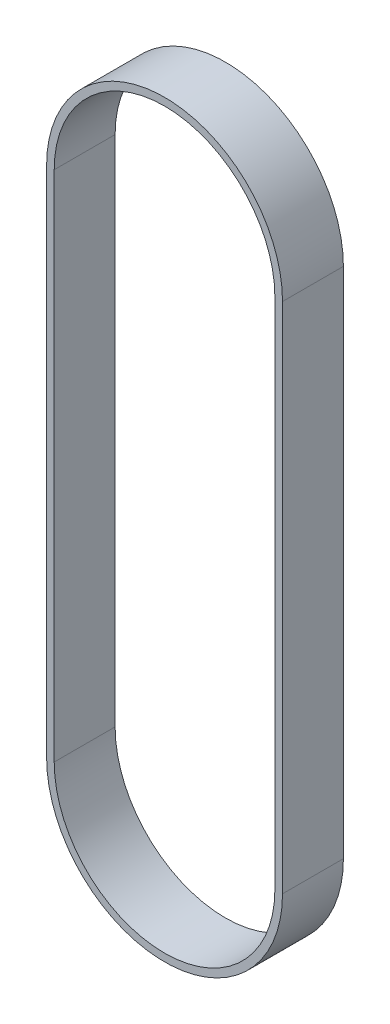
ISO-10303-21;
HEADER;
FILE_DESCRIPTION(('STEP AP214'),'2;1');
FILE_NAME('part.step','',(''),(''),'','','');
FILE_SCHEMA(('AUTOMOTIVE_DESIGN { 1 0 10303 214 1 1 1 1 }'));
ENDSEC;
DATA;
#1=APPLICATION_CONTEXT('core data for automotive mechanical design processes');
#2=APPLICATION_PROTOCOL_DEFINITION('international standard','automotive_design',2000,#1);
#3=PRODUCT_CONTEXT('',#1,'mechanical');
#4=PRODUCT('Part','Part','',(#3));
#5=PRODUCT_RELATED_PRODUCT_CATEGORY('part','',(#4));
#6=PRODUCT_DEFINITION_FORMATION('','',#4);
#7=PRODUCT_DEFINITION_CONTEXT('part definition',#1,'design');
#8=PRODUCT_DEFINITION('design','',#6,#7);
#9=PRODUCT_DEFINITION_SHAPE('','',#8);
#10=(LENGTH_UNIT() NAMED_UNIT(*) SI_UNIT(.MILLI.,.METRE.));
#11=(NAMED_UNIT(*) PLANE_ANGLE_UNIT() SI_UNIT($,.RADIAN.));
#12=(NAMED_UNIT(*) SI_UNIT($,.STERADIAN.) SOLID_ANGLE_UNIT());
#13=UNCERTAINTY_MEASURE_WITH_UNIT(LENGTH_MEASURE(1.E-05),#10,'distance_accuracy_value','');
#14=(GEOMETRIC_REPRESENTATION_CONTEXT(3) GLOBAL_UNCERTAINTY_ASSIGNED_CONTEXT((#13)) GLOBAL_UNIT_ASSIGNED_CONTEXT((#10,
#11,#12)) REPRESENTATION_CONTEXT('',''));
#15=CARTESIAN_POINT('',(0.,0.,0.));
#16=DIRECTION('',(0.,0.,1.));
#17=DIRECTION('',(1.,0.,0.));
#18=AXIS2_PLACEMENT_3D('',#15,#16,#17);
#19=CARTESIAN_POINT('',(-38.7418750000002,-9.4929307610427E-13,20.));
#20=DIRECTION('',(-1.,0.,0.));
#21=DIRECTION('',(0.,-1.,0.));
#22=AXIS2_PLACEMENT_3D('',#19,#20,#21);
#23=PLANE('',#22);
#24=DIRECTION('',(0.,1.,0.));
#25=VECTOR('',#24,1.);
#26=CARTESIAN_POINT('',(-38.7418750000002,-9.4929307610427E-13,0.));
#27=LINE('',#26,#25);
#28=CARTESIAN_POINT('',(-38.7418750000024,-168.482249999999,0.));
#29=VERTEX_POINT('',#28);
#30=CARTESIAN_POINT('',(-38.7418750000002,-9.43689570931383E-13,0.));
#31=VERTEX_POINT('',#30);
#32=EDGE_CURVE('E157',#29,#31,#27,.T.);
#33=ORIENTED_EDGE('',*,*,#32,.F.);
#34=DIRECTION('',(0.,0.,-1.));
#35=VECTOR('',#34,1.);
#36=CARTESIAN_POINT('',(-38.7418750000024,-168.482249999999,20.));
#37=LINE('',#36,#35);
#38=CARTESIAN_POINT('',(-38.7418750000024,-168.482249999999,20.));
#39=VERTEX_POINT('',#38);
#40=EDGE_CURVE('E12',#39,#29,#37,.T.);
#41=ORIENTED_EDGE('',*,*,#40,.F.);
#42=DIRECTION('',(0.,1.,0.));
#43=VECTOR('',#42,1.);
#44=CARTESIAN_POINT('',(-38.7418750000002,-9.4929307610427E-13,20.));
#45=LINE('',#44,#43);
#46=CARTESIAN_POINT('',(-38.7418750000002,-9.43689570931383E-13,20.));
#47=VERTEX_POINT('',#46);
#48=EDGE_CURVE('E161',#39,#47,#45,.T.);
#49=ORIENTED_EDGE('',*,*,#48,.T.);
#50=DIRECTION('',(0.,0.,-1.));
#51=VECTOR('',#50,1.);
#52=CARTESIAN_POINT('',(-38.7418750000002,-9.43689570931383E-13,20.));
#53=LINE('',#52,#51);
#54=EDGE_CURVE('E62',#47,#31,#53,.T.);
#55=ORIENTED_EDGE('',*,*,#54,.T.);
#56=EDGE_LOOP('',(#33,#41,#49,#55));
#57=FACE_BOUND('',#56,.T.);
#58=ADVANCED_FACE('F59',(#57),#23,.T.);
#59=CARTESIAN_POINT('',(-2.41473507855972E-12,-168.482249999999,20.));
#60=DIRECTION('',(0.,0.,-1.));
#61=DIRECTION('',(-1.,0.,0.));
#62=AXIS2_PLACEMENT_3D('',#59,#60,#61);
#63=CYLINDRICAL_SURFACE('',#62,38.741875);
#64=CARTESIAN_POINT('',(-2.41473507855972E-12,-168.482249999999,0.));
#65=DIRECTION('',(0.,0.,-1.));
#66=DIRECTION('',(-1.,0.,0.));
#67=AXIS2_PLACEMENT_3D('',#64,#65,#66);
#68=CIRCLE('',#67,38.741875);
#69=CARTESIAN_POINT('',(38.7418749999976,-168.482249999999,0.));
#70=VERTEX_POINT('',#69);
#71=EDGE_CURVE('E165',#70,#29,#68,.T.);
#72=ORIENTED_EDGE('',*,*,#71,.F.);
#73=DIRECTION('',(0.,0.,-1.));
#74=VECTOR('',#73,1.);
#75=CARTESIAN_POINT('',(38.7418749999976,-168.482249999999,20.));
#76=LINE('',#75,#74);
#77=CARTESIAN_POINT('',(38.7418749999976,-168.482249999999,20.));
#78=VERTEX_POINT('',#77);
#79=EDGE_CURVE('E67',#78,#70,#76,.T.);
#80=ORIENTED_EDGE('',*,*,#79,.F.);
#81=CARTESIAN_POINT('',(-2.41473507855972E-12,-168.482249999999,20.));
#82=DIRECTION('',(0.,0.,-1.));
#83=DIRECTION('',(-1.,0.,0.));
#84=AXIS2_PLACEMENT_3D('',#81,#82,#83);
#85=CIRCLE('',#84,38.741875);
#86=EDGE_CURVE('E171',#78,#39,#85,.T.);
#87=ORIENTED_EDGE('',*,*,#86,.T.);
#88=ORIENTED_EDGE('',*,*,#40,.T.);
#89=EDGE_LOOP('',(#72,#80,#87,#88));
#90=FACE_BOUND('',#89,.T.);
#91=ADVANCED_FACE('F197',(#90),#63,.T.);
#92=CARTESIAN_POINT('',(38.7418749999999,-2.00875367100328E-12,20.));
#93=DIRECTION('',(1.,0.,0.));
#94=DIRECTION('',(0.,1.,0.));
#95=AXIS2_PLACEMENT_3D('',#92,#93,#94);
#96=PLANE('',#95);
#97=DIRECTION('',(0.,-1.,0.));
#98=VECTOR('',#97,1.);
#99=CARTESIAN_POINT('',(38.7418749999999,-2.00875367100328E-12,0.));
#100=LINE('',#99,#98);
#101=CARTESIAN_POINT('',(38.7418749999999,-1.98244645601296E-12,0.));
#102=VERTEX_POINT('',#101);
#103=EDGE_CURVE('E179',#102,#70,#100,.T.);
#104=ORIENTED_EDGE('',*,*,#103,.F.);
#105=DIRECTION('',(0.,0.,-1.));
#106=VECTOR('',#105,1.);
#107=CARTESIAN_POINT('',(38.7418749999999,-1.98244645601296E-12,20.));
#108=LINE('',#107,#106);
#109=CARTESIAN_POINT('',(38.7418749999999,-1.98244645601296E-12,20.));
#110=VERTEX_POINT('',#109);
#111=EDGE_CURVE('E184',#110,#102,#108,.T.);
#112=ORIENTED_EDGE('',*,*,#111,.F.);
#113=DIRECTION('',(0.,-1.,0.));
#114=VECTOR('',#113,1.);
#115=CARTESIAN_POINT('',(38.7418749999999,-2.00875367100328E-12,20.));
#116=LINE('',#115,#114);
#117=EDGE_CURVE('E168',#110,#78,#116,.T.);
#118=ORIENTED_EDGE('',*,*,#117,.T.);
#119=ORIENTED_EDGE('',*,*,#79,.T.);
#120=EDGE_LOOP('',(#104,#112,#118,#119));
#121=FACE_BOUND('',#120,.T.);
#122=ADVANCED_FACE('F201',(#121),#96,.T.);
#123=CARTESIAN_POINT('',(-1.11022302462516E-13,-1.47104550762833E-12,20.));
#124=DIRECTION('',(0.,0.,-1.));
#125=DIRECTION('',(-1.,0.,0.));
#126=AXIS2_PLACEMENT_3D('',#123,#124,#125);
#127=CYLINDRICAL_SURFACE('',#126,38.741875);
#128=CARTESIAN_POINT('',(-1.11022302462516E-13,-1.47104550762833E-12,0.));
#129=DIRECTION('',(0.,0.,-1.));
#130=DIRECTION('',(-1.,0.,0.));
#131=AXIS2_PLACEMENT_3D('',#128,#129,#130);
#132=CIRCLE('',#131,38.741875);
#133=EDGE_CURVE('E176',#31,#102,#132,.T.);
#134=ORIENTED_EDGE('',*,*,#133,.F.);
#135=ORIENTED_EDGE('',*,*,#54,.F.);
#136=CARTESIAN_POINT('',(-1.11022302462516E-13,-1.47104550762833E-12,20.));
#137=DIRECTION('',(0.,0.,-1.));
#138=DIRECTION('',(-1.,0.,0.));
#139=AXIS2_PLACEMENT_3D('',#136,#137,#138);
#140=CIRCLE('',#139,38.741875);
#141=EDGE_CURVE('E164',#47,#110,#140,.T.);
#142=ORIENTED_EDGE('',*,*,#141,.T.);
#143=ORIENTED_EDGE('',*,*,#111,.T.);
#144=EDGE_LOOP('',(#134,#135,#142,#143));
#145=FACE_BOUND('',#144,.T.);
#146=ADVANCED_FACE('F192',(#145),#127,.T.);
#147=CARTESIAN_POINT('',(-1.11022302462516E-13,-1.47104550762833E-12,20.));
#148=DIRECTION('',(0.,0.,-1.));
#149=DIRECTION('',(-1.,0.,0.));
#150=AXIS2_PLACEMENT_3D('',#147,#148,#149);
#151=PLANE('',#150);
#152=CARTESIAN_POINT('',(-2.41473507855972E-12,-168.482249999999,20.));
#153=DIRECTION('',(0.,0.,-1.));
#154=DIRECTION('',(-1.,0.,0.));
#155=AXIS2_PLACEMENT_3D('',#152,#153,#154);
#156=CIRCLE('',#155,36.241875);
#157=CARTESIAN_POINT('',(36.2418749999976,-168.482249999999,20.));
#158=VERTEX_POINT('',#157);
#159=CARTESIAN_POINT('',(-36.2418750000024,-168.482249999999,20.));
#160=VERTEX_POINT('',#159);
#161=EDGE_CURVE('E132',#158,#160,#156,.T.);
#162=ORIENTED_EDGE('',*,*,#161,.T.);
#163=DIRECTION('',(0.,1.,0.));
#164=VECTOR('',#163,1.);
#165=CARTESIAN_POINT('',(-36.2418750000024,-168.482249999998,20.));
#166=LINE('',#165,#164);
#167=CARTESIAN_POINT('',(-36.2418750000001,-9.82961582824973E-13,20.));
#168=VERTEX_POINT('',#167);
#169=EDGE_CURVE('E126',#160,#168,#166,.T.);
#170=ORIENTED_EDGE('',*,*,#169,.T.);
#171=CARTESIAN_POINT('',(-1.11022302462516E-13,-1.47104550762833E-12,20.));
#172=DIRECTION('',(0.,0.,-1.));
#173=DIRECTION('',(-1.,0.,0.));
#174=AXIS2_PLACEMENT_3D('',#171,#172,#173);
#175=CIRCLE('',#174,36.241875);
#176=CARTESIAN_POINT('',(36.2418749999999,-1.96554055260623E-12,20.));
#177=VERTEX_POINT('',#176);
#178=EDGE_CURVE('E135',#168,#177,#175,.T.);
#179=ORIENTED_EDGE('',*,*,#178,.T.);
#180=DIRECTION('',(0.,-1.,0.));
#181=VECTOR('',#180,1.);
#182=CARTESIAN_POINT('',(36.2418749999999,-1.97405554634005E-12,20.));
#183=LINE('',#182,#181);
#184=EDGE_CURVE('E75',#177,#158,#183,.T.);
#185=ORIENTED_EDGE('',*,*,#184,.T.);
#186=EDGE_LOOP('',(#162,#170,#179,#185));
#187=FACE_BOUND('',#186,.T.);
#188=ORIENTED_EDGE('',*,*,#48,.F.);
#189=ORIENTED_EDGE('',*,*,#86,.F.);
#190=ORIENTED_EDGE('',*,*,#117,.F.);
#191=ORIENTED_EDGE('',*,*,#141,.F.);
#192=EDGE_LOOP('',(#188,#189,#190,#191));
#193=FACE_BOUND('',#192,.T.);
#194=ADVANCED_FACE('F139',(#187,#193),#151,.F.);
#195=CARTESIAN_POINT('',(-1.11022302462516E-13,-1.47104550762833E-12,0.));
#196=DIRECTION('',(0.,0.,-1.));
#197=DIRECTION('',(-1.,0.,0.));
#198=AXIS2_PLACEMENT_3D('',#195,#196,#197);
#199=PLANE('',#198);
#200=DIRECTION('',(0.,1.,0.));
#201=VECTOR('',#200,1.);
#202=CARTESIAN_POINT('',(-36.2418750000024,-168.482249999998,0.));
#203=LINE('',#202,#201);
#204=CARTESIAN_POINT('',(-36.2418750000024,-168.482249999999,0.));
#205=VERTEX_POINT('',#204);
#206=CARTESIAN_POINT('',(-36.2418750000001,-1.47104550762833E-12,0.));
#207=VERTEX_POINT('',#206);
#208=EDGE_CURVE('E83',#205,#207,#203,.T.);
#209=ORIENTED_EDGE('',*,*,#208,.F.);
#210=CARTESIAN_POINT('',(-2.41473507855972E-12,-168.482249999999,0.));
#211=DIRECTION('',(0.,0.,-1.));
#212=DIRECTION('',(-1.,0.,0.));
#213=AXIS2_PLACEMENT_3D('',#210,#211,#212);
#214=CIRCLE('',#213,36.241875);
#215=CARTESIAN_POINT('',(36.2418749999976,-168.482249999999,0.));
#216=VERTEX_POINT('',#215);
#217=EDGE_CURVE('E142',#216,#205,#214,.T.);
#218=ORIENTED_EDGE('',*,*,#217,.F.);
#219=DIRECTION('',(0.,-1.,0.));
#220=VECTOR('',#219,1.);
#221=CARTESIAN_POINT('',(36.2418749999999,-1.97405554634005E-12,0.));
#222=LINE('',#221,#220);
#223=CARTESIAN_POINT('',(36.2418749999999,-1.96554055260623E-12,0.));
#224=VERTEX_POINT('',#223);
#225=EDGE_CURVE('E145',#224,#216,#222,.T.);
#226=ORIENTED_EDGE('',*,*,#225,.F.);
#227=CARTESIAN_POINT('',(-1.11022302462516E-13,-1.47104550762833E-12,0.));
#228=DIRECTION('',(0.,0.,-1.));
#229=DIRECTION('',(-1.,0.,0.));
#230=AXIS2_PLACEMENT_3D('',#227,#228,#229);
#231=CIRCLE('',#230,36.241875);
#232=EDGE_CURVE('E151',#207,#224,#231,.T.);
#233=ORIENTED_EDGE('',*,*,#232,.F.);
#234=EDGE_LOOP('',(#209,#218,#226,#233));
#235=FACE_BOUND('',#234,.T.);
#236=ORIENTED_EDGE('',*,*,#32,.T.);
#237=ORIENTED_EDGE('',*,*,#133,.T.);
#238=ORIENTED_EDGE('',*,*,#103,.T.);
#239=ORIENTED_EDGE('',*,*,#71,.T.);
#240=EDGE_LOOP('',(#236,#237,#238,#239));
#241=FACE_BOUND('',#240,.T.);
#242=ADVANCED_FACE('F194',(#235,#241),#199,.T.);
#243=CARTESIAN_POINT('',(-36.2418750000024,-168.482249999998,20.));
#244=DIRECTION('',(-1.,0.,0.));
#245=DIRECTION('',(0.,-1.,0.));
#246=AXIS2_PLACEMENT_3D('',#243,#244,#245);
#247=PLANE('',#246);
#248=ORIENTED_EDGE('',*,*,#208,.T.);
#249=DIRECTION('',(0.,0.,-1.));
#250=VECTOR('',#249,1.);
#251=CARTESIAN_POINT('',(-36.2418750000001,-9.82961582824973E-13,20.));
#252=LINE('',#251,#250);
#253=EDGE_CURVE('E122',#168,#207,#252,.T.);
#254=ORIENTED_EDGE('',*,*,#253,.F.);
#255=ORIENTED_EDGE('',*,*,#169,.F.);
#256=DIRECTION('',(0.,0.,-1.));
#257=VECTOR('',#256,1.);
#258=CARTESIAN_POINT('',(-36.2418750000024,-168.482249999999,20.));
#259=LINE('',#258,#257);
#260=EDGE_CURVE('E155',#160,#205,#259,.T.);
#261=ORIENTED_EDGE('',*,*,#260,.T.);
#262=EDGE_LOOP('',(#248,#254,#255,#261));
#263=FACE_BOUND('',#262,.T.);
#264=ADVANCED_FACE('F124',(#263),#247,.F.);
#265=CARTESIAN_POINT('',(-2.41473507855972E-12,-168.482249999999,20.));
#266=DIRECTION('',(0.,0.,-1.));
#267=DIRECTION('',(-1.,0.,0.));
#268=AXIS2_PLACEMENT_3D('',#265,#266,#267);
#269=CYLINDRICAL_SURFACE('',#268,36.241875);
#270=ORIENTED_EDGE('',*,*,#217,.T.);
#271=ORIENTED_EDGE('',*,*,#260,.F.);
#272=ORIENTED_EDGE('',*,*,#161,.F.);
#273=DIRECTION('',(0.,0.,-1.));
#274=VECTOR('',#273,1.);
#275=CARTESIAN_POINT('',(36.2418749999976,-168.482249999999,20.));
#276=LINE('',#275,#274);
#277=EDGE_CURVE('E158',#158,#216,#276,.T.);
#278=ORIENTED_EDGE('',*,*,#277,.T.);
#279=EDGE_LOOP('',(#270,#271,#272,#278));
#280=FACE_BOUND('',#279,.T.);
#281=ADVANCED_FACE('F252',(#280),#269,.F.);
#282=CARTESIAN_POINT('',(36.2418749999999,-1.97405554634005E-12,20.));
#283=DIRECTION('',(1.,0.,0.));
#284=DIRECTION('',(0.,1.,0.));
#285=AXIS2_PLACEMENT_3D('',#282,#283,#284);
#286=PLANE('',#285);
#287=ORIENTED_EDGE('',*,*,#225,.T.);
#288=ORIENTED_EDGE('',*,*,#277,.F.);
#289=ORIENTED_EDGE('',*,*,#184,.F.);
#290=DIRECTION('',(0.,0.,-1.));
#291=VECTOR('',#290,1.);
#292=CARTESIAN_POINT('',(36.2418749999999,-1.96554055260623E-12,20.));
#293=LINE('',#292,#291);
#294=EDGE_CURVE('E131',#177,#224,#293,.T.);
#295=ORIENTED_EDGE('',*,*,#294,.T.);
#296=EDGE_LOOP('',(#287,#288,#289,#295));
#297=FACE_BOUND('',#296,.T.);
#298=ADVANCED_FACE('F261',(#297),#286,.F.);
#299=CARTESIAN_POINT('',(-1.11022302462516E-13,-1.47104550762833E-12,20.));
#300=DIRECTION('',(0.,0.,-1.));
#301=DIRECTION('',(-1.,0.,0.));
#302=AXIS2_PLACEMENT_3D('',#299,#300,#301);
#303=CYLINDRICAL_SURFACE('',#302,36.241875);
#304=ORIENTED_EDGE('',*,*,#232,.T.);
#305=ORIENTED_EDGE('',*,*,#294,.F.);
#306=ORIENTED_EDGE('',*,*,#178,.F.);
#307=ORIENTED_EDGE('',*,*,#253,.T.);
#308=EDGE_LOOP('',(#304,#305,#306,#307));
#309=FACE_BOUND('',#308,.T.);
#310=ADVANCED_FACE('F136',(#309),#303,.F.);
#311=CLOSED_SHELL('',(#58,#91,#122,#146,#194,#242,#264,#281,#298,#310));
#312=MANIFOLD_SOLID_BREP('B2',#311);
#313=ADVANCED_BREP_SHAPE_REPRESENTATION('',(#18,#312),#14);
#314=SHAPE_DEFINITION_REPRESENTATION(#9,#313);
ENDSEC;
END-ISO-10303-21;
